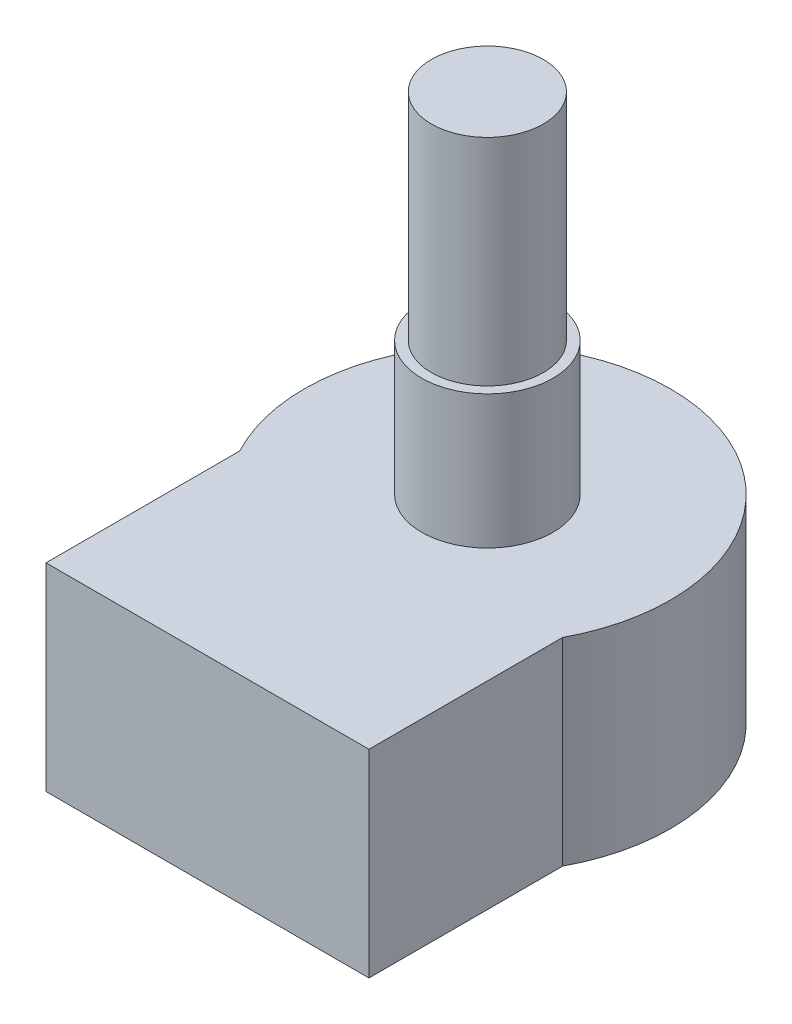
ISO-10303-21;
HEADER;
FILE_DESCRIPTION(('STEP AP214'),'2;1');
FILE_NAME('part.step','',(''),(''),'','','');
FILE_SCHEMA(('AUTOMOTIVE_DESIGN { 1 0 10303 214 1 1 1 1 }'));
ENDSEC;
DATA;
#1=APPLICATION_CONTEXT('core data for automotive mechanical design processes');
#2=APPLICATION_PROTOCOL_DEFINITION('international standard','automotive_design',2000,#1);
#3=PRODUCT_CONTEXT('',#1,'mechanical');
#4=PRODUCT('Part','Part','',(#3));
#5=PRODUCT_RELATED_PRODUCT_CATEGORY('part','',(#4));
#6=PRODUCT_DEFINITION_FORMATION('','',#4);
#7=PRODUCT_DEFINITION_CONTEXT('part definition',#1,'design');
#8=PRODUCT_DEFINITION('design','',#6,#7);
#9=PRODUCT_DEFINITION_SHAPE('','',#8);
#10=(LENGTH_UNIT() NAMED_UNIT(*) SI_UNIT(.MILLI.,.METRE.));
#11=(NAMED_UNIT(*) PLANE_ANGLE_UNIT() SI_UNIT($,.RADIAN.));
#12=(NAMED_UNIT(*) SI_UNIT($,.STERADIAN.) SOLID_ANGLE_UNIT());
#13=UNCERTAINTY_MEASURE_WITH_UNIT(LENGTH_MEASURE(1.E-05),#10,'distance_accuracy_value','');
#14=(GEOMETRIC_REPRESENTATION_CONTEXT(3) GLOBAL_UNCERTAINTY_ASSIGNED_CONTEXT((#13)) GLOBAL_UNIT_ASSIGNED_CONTEXT((#10,
#11,#12)) REPRESENTATION_CONTEXT('',''));
#15=CARTESIAN_POINT('',(0.,0.,0.));
#16=DIRECTION('',(0.,0.,1.));
#17=DIRECTION('',(1.,0.,0.));
#18=AXIS2_PLACEMENT_3D('',#15,#16,#17);
#19=CARTESIAN_POINT('',(0.,9.2,0.));
#20=DIRECTION('',(0.,-1.,0.));
#21=DIRECTION('',(0.,0.,-1.));
#22=AXIS2_PLACEMENT_3D('',#19,#20,#21);
#23=CYLINDRICAL_SURFACE('',#22,8.5);
#24=CARTESIAN_POINT('',(0.,0.,0.));
#25=DIRECTION('',(0.,1.,0.));
#26=DIRECTION('',(0.,0.,1.));
#27=AXIS2_PLACEMENT_3D('',#24,#25,#26);
#28=CIRCLE('',#27,8.5);
#29=CARTESIAN_POINT('',(7.5,0.,4.));
#30=VERTEX_POINT('',#29);
#31=CARTESIAN_POINT('',(-7.5,0.,4.));
#32=VERTEX_POINT('',#31);
#33=EDGE_CURVE('E102',#30,#32,#28,.T.);
#34=ORIENTED_EDGE('',*,*,#33,.T.);
#35=DIRECTION('',(0.,-1.,0.));
#36=VECTOR('',#35,1.);
#37=CARTESIAN_POINT('',(-7.5,9.2,4.));
#38=LINE('',#37,#36);
#39=CARTESIAN_POINT('',(-7.5,9.2,4.));
#40=VERTEX_POINT('',#39);
#41=EDGE_CURVE('E38',#40,#32,#38,.T.);
#42=ORIENTED_EDGE('',*,*,#41,.F.);
#43=CARTESIAN_POINT('',(0.,9.2,0.));
#44=DIRECTION('',(0.,1.,0.));
#45=DIRECTION('',(0.,0.,1.));
#46=AXIS2_PLACEMENT_3D('',#43,#44,#45);
#47=CIRCLE('',#46,8.5);
#48=CARTESIAN_POINT('',(7.5,9.2,4.));
#49=VERTEX_POINT('',#48);
#50=EDGE_CURVE('E87',#49,#40,#47,.T.);
#51=ORIENTED_EDGE('',*,*,#50,.F.);
#52=DIRECTION('',(0.,-1.,0.));
#53=VECTOR('',#52,1.);
#54=CARTESIAN_POINT('',(7.5,9.2,4.));
#55=LINE('',#54,#53);
#56=EDGE_CURVE('E53',#49,#30,#55,.T.);
#57=ORIENTED_EDGE('',*,*,#56,.T.);
#58=EDGE_LOOP('',(#34,#42,#51,#57));
#59=FACE_BOUND('',#58,.T.);
#60=ADVANCED_FACE('F35',(#59),#23,.T.);
#61=CARTESIAN_POINT('',(-7.5,9.2,0.));
#62=DIRECTION('',(1.,0.,0.));
#63=DIRECTION('',(0.,0.,-1.));
#64=AXIS2_PLACEMENT_3D('',#61,#62,#63);
#65=PLANE('',#64);
#66=DIRECTION('',(0.,0.,1.));
#67=VECTOR('',#66,1.);
#68=CARTESIAN_POINT('',(-7.5,0.,0.));
#69=LINE('',#68,#67);
#70=CARTESIAN_POINT('',(-7.5,0.,13.));
#71=VERTEX_POINT('',#70);
#72=EDGE_CURVE('E93',#32,#71,#69,.T.);
#73=ORIENTED_EDGE('',*,*,#72,.T.);
#74=DIRECTION('',(0.,-1.,0.));
#75=VECTOR('',#74,1.);
#76=CARTESIAN_POINT('',(-7.5,9.2,13.));
#77=LINE('',#76,#75);
#78=CARTESIAN_POINT('',(-7.5,9.2,13.));
#79=VERTEX_POINT('',#78);
#80=EDGE_CURVE('E91',#79,#71,#77,.T.);
#81=ORIENTED_EDGE('',*,*,#80,.F.);
#82=DIRECTION('',(0.,0.,1.));
#83=VECTOR('',#82,1.);
#84=CARTESIAN_POINT('',(-7.5,9.2,0.));
#85=LINE('',#84,#83);
#86=EDGE_CURVE('E80',#40,#79,#85,.T.);
#87=ORIENTED_EDGE('',*,*,#86,.F.);
#88=ORIENTED_EDGE('',*,*,#41,.T.);
#89=EDGE_LOOP('',(#73,#81,#87,#88));
#90=FACE_BOUND('',#89,.T.);
#91=ADVANCED_FACE('F92',(#90),#65,.F.);
#92=CARTESIAN_POINT('',(0.,9.2,13.));
#93=DIRECTION('',(0.,0.,-1.));
#94=DIRECTION('',(-1.,0.,0.));
#95=AXIS2_PLACEMENT_3D('',#92,#93,#94);
#96=PLANE('',#95);
#97=DIRECTION('',(1.,0.,0.));
#98=VECTOR('',#97,1.);
#99=CARTESIAN_POINT('',(0.,0.,13.));
#100=LINE('',#99,#98);
#101=CARTESIAN_POINT('',(7.5,0.,13.));
#102=VERTEX_POINT('',#101);
#103=EDGE_CURVE('E106',#71,#102,#100,.T.);
#104=ORIENTED_EDGE('',*,*,#103,.T.);
#105=DIRECTION('',(0.,-1.,0.));
#106=VECTOR('',#105,1.);
#107=CARTESIAN_POINT('',(7.5,9.2,13.));
#108=LINE('',#107,#106);
#109=CARTESIAN_POINT('',(7.5,9.2,13.));
#110=VERTEX_POINT('',#109);
#111=EDGE_CURVE('E68',#110,#102,#108,.T.);
#112=ORIENTED_EDGE('',*,*,#111,.F.);
#113=DIRECTION('',(1.,0.,0.));
#114=VECTOR('',#113,1.);
#115=CARTESIAN_POINT('',(0.,9.2,13.));
#116=LINE('',#115,#114);
#117=EDGE_CURVE('E86',#79,#110,#116,.T.);
#118=ORIENTED_EDGE('',*,*,#117,.F.);
#119=ORIENTED_EDGE('',*,*,#80,.T.);
#120=EDGE_LOOP('',(#104,#112,#118,#119));
#121=FACE_BOUND('',#120,.T.);
#122=ADVANCED_FACE('F96',(#121),#96,.F.);
#123=CARTESIAN_POINT('',(7.5,9.2,0.));
#124=DIRECTION('',(1.,0.,0.));
#125=DIRECTION('',(0.,0.,-1.));
#126=AXIS2_PLACEMENT_3D('',#123,#124,#125);
#127=PLANE('',#126);
#128=DIRECTION('',(0.,0.,1.));
#129=VECTOR('',#128,1.);
#130=CARTESIAN_POINT('',(7.5,0.,0.));
#131=LINE('',#130,#129);
#132=EDGE_CURVE('E108',#30,#102,#131,.T.);
#133=ORIENTED_EDGE('',*,*,#132,.F.);
#134=ORIENTED_EDGE('',*,*,#56,.F.);
#135=DIRECTION('',(0.,0.,1.));
#136=VECTOR('',#135,1.);
#137=CARTESIAN_POINT('',(7.5,9.2,0.));
#138=LINE('',#137,#136);
#139=EDGE_CURVE('E97',#49,#110,#138,.T.);
#140=ORIENTED_EDGE('',*,*,#139,.T.);
#141=ORIENTED_EDGE('',*,*,#111,.T.);
#142=EDGE_LOOP('',(#133,#134,#140,#141));
#143=FACE_BOUND('',#142,.T.);
#144=ADVANCED_FACE('F144',(#143),#127,.T.);
#145=CARTESIAN_POINT('',(0.,9.2,0.));
#146=DIRECTION('',(0.,1.,0.));
#147=DIRECTION('',(0.,0.,1.));
#148=AXIS2_PLACEMENT_3D('',#145,#146,#147);
#149=PLANE('',#148);
#150=CARTESIAN_POINT('',(0.,9.2,0.));
#151=DIRECTION('',(0.,1.,0.));
#152=DIRECTION('',(0.,0.,1.));
#153=AXIS2_PLACEMENT_3D('',#150,#151,#152);
#154=CIRCLE('',#153,3.05);
#155=CARTESIAN_POINT('',(0.,9.2,-3.05));
#156=VERTEX_POINT('',#155);
#157=EDGE_CURVE('E44',#156,#156,#154,.T.);
#158=ORIENTED_EDGE('',*,*,#157,.F.);
#159=EDGE_LOOP('',(#158));
#160=FACE_BOUND('',#159,.T.);
#161=ORIENTED_EDGE('',*,*,#50,.T.);
#162=ORIENTED_EDGE('',*,*,#86,.T.);
#163=ORIENTED_EDGE('',*,*,#117,.T.);
#164=ORIENTED_EDGE('',*,*,#139,.F.);
#165=EDGE_LOOP('',(#161,#162,#163,#164));
#166=FACE_BOUND('',#165,.T.);
#167=ADVANCED_FACE('F83',(#160,#166),#149,.T.);
#168=CARTESIAN_POINT('',(0.,0.,0.));
#169=DIRECTION('',(0.,1.,0.));
#170=DIRECTION('',(0.,0.,1.));
#171=AXIS2_PLACEMENT_3D('',#168,#169,#170);
#172=PLANE('',#171);
#173=ORIENTED_EDGE('',*,*,#33,.F.);
#174=ORIENTED_EDGE('',*,*,#132,.T.);
#175=ORIENTED_EDGE('',*,*,#103,.F.);
#176=ORIENTED_EDGE('',*,*,#72,.F.);
#177=EDGE_LOOP('',(#173,#174,#175,#176));
#178=FACE_BOUND('',#177,.T.);
#179=ADVANCED_FACE('F139',(#178),#172,.F.);
#180=CARTESIAN_POINT('',(0.,15.4,0.));
#181=DIRECTION('',(0.,-1.,0.));
#182=DIRECTION('',(0.,0.,-1.));
#183=AXIS2_PLACEMENT_3D('',#180,#181,#182);
#184=CYLINDRICAL_SURFACE('',#183,3.05);
#185=CARTESIAN_POINT('',(0.,15.4,0.));
#186=DIRECTION('',(0.,1.,0.));
#187=DIRECTION('',(0.,0.,1.));
#188=AXIS2_PLACEMENT_3D('',#185,#186,#187);
#189=CIRCLE('',#188,3.05);
#190=CARTESIAN_POINT('',(0.,15.4,-3.05));
#191=VERTEX_POINT('',#190);
#192=EDGE_CURVE('E104',#191,#191,#189,.T.);
#193=CARTESIAN_POINT('',(0.,15.4,-3.05));
#194=CARTESIAN_POINT('',(0.,15.3354166666667,-3.05));
#195=CARTESIAN_POINT('',(0.,15.2708333333333,-3.05));
#196=CARTESIAN_POINT('',(0.,15.1416666666667,-3.05));
#197=CARTESIAN_POINT('',(0.,15.0770833333333,-3.05));
#198=CARTESIAN_POINT('',(0.,14.9479166666667,-3.05));
#199=CARTESIAN_POINT('',(0.,14.8833333333333,-3.05));
#200=CARTESIAN_POINT('',(0.,14.7541666666667,-3.05));
#201=CARTESIAN_POINT('',(0.,14.6895833333333,-3.05));
#202=CARTESIAN_POINT('',(0.,14.5604166666667,-3.05));
#203=CARTESIAN_POINT('',(0.,14.4958333333333,-3.05));
#204=CARTESIAN_POINT('',(0.,14.3666666666667,-3.05));
#205=CARTESIAN_POINT('',(0.,14.3020833333333,-3.05));
#206=CARTESIAN_POINT('',(0.,14.1729166666667,-3.05));
#207=CARTESIAN_POINT('',(0.,14.1083333333333,-3.05));
#208=CARTESIAN_POINT('',(0.,13.9791666666667,-3.05));
#209=CARTESIAN_POINT('',(0.,13.9145833333333,-3.05));
#210=CARTESIAN_POINT('',(0.,13.7854166666667,-3.05));
#211=CARTESIAN_POINT('',(0.,13.7208333333333,-3.05));
#212=CARTESIAN_POINT('',(0.,13.5916666666667,-3.05));
#213=CARTESIAN_POINT('',(0.,13.5270833333333,-3.05));
#214=CARTESIAN_POINT('',(0.,13.3979166666667,-3.05));
#215=CARTESIAN_POINT('',(0.,13.3333333333333,-3.05));
#216=CARTESIAN_POINT('',(0.,13.2041666666667,-3.05));
#217=CARTESIAN_POINT('',(0.,13.1395833333333,-3.05));
#218=CARTESIAN_POINT('',(0.,13.0104166666667,-3.05));
#219=CARTESIAN_POINT('',(0.,12.9458333333333,-3.05));
#220=CARTESIAN_POINT('',(0.,12.8166666666667,-3.05));
#221=CARTESIAN_POINT('',(0.,12.7520833333333,-3.05));
#222=CARTESIAN_POINT('',(0.,12.6229166666667,-3.05));
#223=CARTESIAN_POINT('',(0.,12.5583333333333,-3.05));
#224=CARTESIAN_POINT('',(0.,12.4291666666667,-3.05));
#225=CARTESIAN_POINT('',(0.,12.3645833333333,-3.05));
#226=CARTESIAN_POINT('',(0.,12.2354166666667,-3.05));
#227=CARTESIAN_POINT('',(0.,12.1708333333333,-3.05));
#228=CARTESIAN_POINT('',(0.,12.0416666666667,-3.05));
#229=CARTESIAN_POINT('',(0.,11.9770833333333,-3.05));
#230=CARTESIAN_POINT('',(0.,11.8479166666667,-3.05));
#231=CARTESIAN_POINT('',(0.,11.7833333333333,-3.05));
#232=CARTESIAN_POINT('',(0.,11.6541666666667,-3.05));
#233=CARTESIAN_POINT('',(0.,11.5895833333333,-3.05));
#234=CARTESIAN_POINT('',(0.,11.4604166666667,-3.05));
#235=CARTESIAN_POINT('',(0.,11.3958333333333,-3.05));
#236=CARTESIAN_POINT('',(0.,11.2666666666667,-3.05));
#237=CARTESIAN_POINT('',(0.,11.2020833333333,-3.05));
#238=CARTESIAN_POINT('',(0.,11.0729166666667,-3.05));
#239=CARTESIAN_POINT('',(0.,11.0083333333333,-3.05));
#240=CARTESIAN_POINT('',(0.,10.8791666666667,-3.05));
#241=CARTESIAN_POINT('',(0.,10.8145833333333,-3.05));
#242=CARTESIAN_POINT('',(0.,10.6854166666667,-3.05));
#243=CARTESIAN_POINT('',(0.,10.6208333333333,-3.05));
#244=CARTESIAN_POINT('',(0.,10.4916666666667,-3.05));
#245=CARTESIAN_POINT('',(0.,10.4270833333333,-3.05));
#246=CARTESIAN_POINT('',(0.,10.2979166666667,-3.05));
#247=CARTESIAN_POINT('',(0.,10.2333333333333,-3.05));
#248=CARTESIAN_POINT('',(0.,10.1041666666667,-3.05));
#249=CARTESIAN_POINT('',(0.,10.0395833333333,-3.05));
#250=CARTESIAN_POINT('',(0.,9.91041666666667,-3.05));
#251=CARTESIAN_POINT('',(0.,9.84583333333333,-3.05));
#252=CARTESIAN_POINT('',(0.,9.71666666666667,-3.05));
#253=CARTESIAN_POINT('',(0.,9.65208333333333,-3.05));
#254=CARTESIAN_POINT('',(0.,9.52291666666667,-3.05));
#255=CARTESIAN_POINT('',(0.,9.45833333333333,-3.05));
#256=CARTESIAN_POINT('',(0.,9.32916666666667,-3.05));
#257=CARTESIAN_POINT('',(0.,9.26458333333333,-3.05));
#258=CARTESIAN_POINT('',(0.,9.2,-3.05));
#259=B_SPLINE_CURVE_WITH_KNOTS('',3,(#193,#194,#195,#196,#197,#198,#199,#200,#201,#202,#203,
#204,#205,#206,#207,#208,#209,#210,#211,#212,#213,#214,#215,#216,#217,#218,#219,#220,#221,#222,
#223,#224,#225,#226,#227,#228,#229,#230,#231,#232,#233,#234,#235,#236,#237,#238,#239,#240,#241,
#242,#243,#244,#245,#246,#247,#248,#249,#250,#251,#252,#253,#254,#255,#256,#257,#258),
.UNSPECIFIED.,.F.,.F.,(4,2,2,2,2,2,2,2,2,2,2,2,2,2,2,2,2,2,2,2,2,2,2,2,2,2,2,2,2,2,2,2,4),(0.,
0.193749999999999,0.387499999999999,0.581249999999998,0.775,0.968749999999999,1.1625,1.35625,
1.55,1.74375,1.9375,2.13125,2.325,2.51875,2.7125,2.90625,3.1,3.29375,3.4875,3.68125,3.875,
4.06875,4.2625,4.45625,4.65,4.84375,5.0375,5.23125,5.425,5.61875,5.8125,6.00625,6.2),.UNSPECIFIED.);
#260=EDGE_CURVE('BSEAM133',#191,#156,#259,.T.);
#261=ORIENTED_EDGE('',*,*,#192,.F.);
#262=ORIENTED_EDGE('',*,*,#157,.T.);
#263=ORIENTED_EDGE('',*,*,#260,.T.);
#264=ORIENTED_EDGE('',*,*,#260,.F.);
#265=EDGE_LOOP('',(#261,#263,#262,#264));
#266=FACE_BOUND('',#265,.T.);
#267=ADVANCED_FACE('F133',(#266),#184,.T.);
#268=CARTESIAN_POINT('',(0.,15.4,0.));
#269=DIRECTION('',(0.,1.,0.));
#270=DIRECTION('',(0.,0.,1.));
#271=AXIS2_PLACEMENT_3D('',#268,#269,#270);
#272=PLANE('',#271);
#273=CARTESIAN_POINT('',(0.,15.4,0.));
#274=DIRECTION('',(0.,1.,0.));
#275=DIRECTION('',(0.,0.,1.));
#276=AXIS2_PLACEMENT_3D('',#273,#274,#275);
#277=CIRCLE('',#276,2.6);
#278=CARTESIAN_POINT('',(0.,15.4,2.6));
#279=VERTEX_POINT('',#278);
#280=EDGE_CURVE('E11',#279,#279,#277,.T.);
#281=ORIENTED_EDGE('',*,*,#280,.F.);
#282=EDGE_LOOP('',(#281));
#283=FACE_BOUND('',#282,.T.);
#284=ORIENTED_EDGE('',*,*,#192,.T.);
#285=EDGE_LOOP('',(#284));
#286=FACE_BOUND('',#285,.T.);
#287=ADVANCED_FACE('F127',(#283,#286),#272,.T.);
#288=CARTESIAN_POINT('',(0.,25.4,0.));
#289=DIRECTION('',(0.,-1.,0.));
#290=DIRECTION('',(0.,0.,-1.));
#291=AXIS2_PLACEMENT_3D('',#288,#289,#290);
#292=CYLINDRICAL_SURFACE('',#291,2.6);
#293=CARTESIAN_POINT('',(0.,25.4,0.));
#294=DIRECTION('',(0.,1.,0.));
#295=DIRECTION('',(0.,0.,1.));
#296=AXIS2_PLACEMENT_3D('',#293,#294,#295);
#297=CIRCLE('',#296,2.6);
#298=CARTESIAN_POINT('',(0.,25.4,2.6));
#299=VERTEX_POINT('',#298);
#300=EDGE_CURVE('E117',#299,#299,#297,.T.);
#301=ORIENTED_EDGE('',*,*,#300,.F.);
#302=EDGE_LOOP('',(#301));
#303=FACE_BOUND('',#302,.T.);
#304=ORIENTED_EDGE('',*,*,#280,.T.);
#305=EDGE_LOOP('',(#304));
#306=FACE_BOUND('',#305,.T.);
#307=ADVANCED_FACE('F124',(#303,#306),#292,.T.);
#308=CARTESIAN_POINT('',(0.,25.4,0.));
#309=DIRECTION('',(0.,1.,0.));
#310=DIRECTION('',(0.,0.,1.));
#311=AXIS2_PLACEMENT_3D('',#308,#309,#310);
#312=PLANE('',#311);
#313=ORIENTED_EDGE('',*,*,#300,.T.);
#314=EDGE_LOOP('',(#313));
#315=FACE_BOUND('',#314,.T.);
#316=ADVANCED_FACE('F122',(#315),#312,.T.);
#317=CLOSED_SHELL('',(#60,#91,#122,#144,#167,#179,#267,#287,#307,#316));
#318=MANIFOLD_SOLID_BREP('B2',#317);
#319=ADVANCED_BREP_SHAPE_REPRESENTATION('',(#18,#318),#14);
#320=SHAPE_DEFINITION_REPRESENTATION(#9,#319);
ENDSEC;
END-ISO-10303-21;
